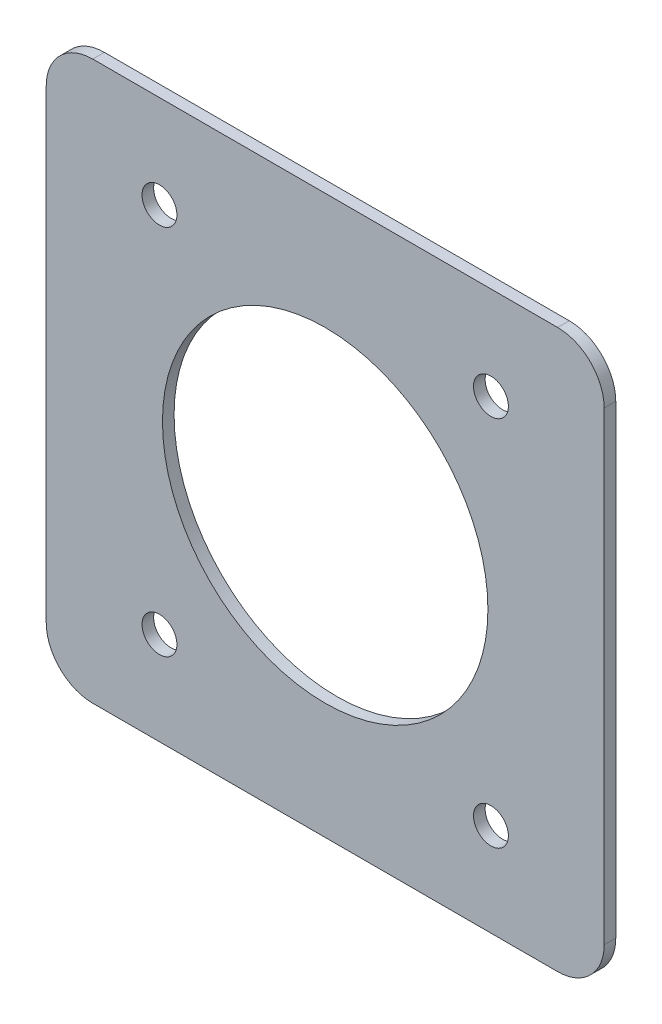
ISO-10303-21;
HEADER;
FILE_DESCRIPTION(('STEP AP214'),'2;1');
FILE_NAME('part.step','',(''),(''),'','','');
FILE_SCHEMA(('AUTOMOTIVE_DESIGN { 1 0 10303 214 1 1 1 1 }'));
ENDSEC;
DATA;
#1=APPLICATION_CONTEXT('core data for automotive mechanical design processes');
#2=APPLICATION_PROTOCOL_DEFINITION('international standard','automotive_design',2000,#1);
#3=PRODUCT_CONTEXT('',#1,'mechanical');
#4=PRODUCT('Part','Part','',(#3));
#5=PRODUCT_RELATED_PRODUCT_CATEGORY('part','',(#4));
#6=PRODUCT_DEFINITION_FORMATION('','',#4);
#7=PRODUCT_DEFINITION_CONTEXT('part definition',#1,'design');
#8=PRODUCT_DEFINITION('design','',#6,#7);
#9=PRODUCT_DEFINITION_SHAPE('','',#8);
#10=(LENGTH_UNIT() NAMED_UNIT(*) SI_UNIT(.MILLI.,.METRE.));
#11=(NAMED_UNIT(*) PLANE_ANGLE_UNIT() SI_UNIT($,.RADIAN.));
#12=(NAMED_UNIT(*) SI_UNIT($,.STERADIAN.) SOLID_ANGLE_UNIT());
#13=UNCERTAINTY_MEASURE_WITH_UNIT(LENGTH_MEASURE(1.E-05),#10,'distance_accuracy_value','');
#14=(GEOMETRIC_REPRESENTATION_CONTEXT(3) GLOBAL_UNCERTAINTY_ASSIGNED_CONTEXT((#13)) GLOBAL_UNIT_ASSIGNED_CONTEXT((#10,
#11,#12)) REPRESENTATION_CONTEXT('',''));
#15=CARTESIAN_POINT('',(0.,0.,0.));
#16=DIRECTION('',(0.,0.,1.));
#17=DIRECTION('',(1.,0.,0.));
#18=AXIS2_PLACEMENT_3D('',#15,#16,#17);
#19=CARTESIAN_POINT('',(-103.997719315894,137.785716341258,3.175));
#20=DIRECTION('',(0.,0.,-1.));
#21=DIRECTION('',(-1.,0.,0.));
#22=AXIS2_PLACEMENT_3D('',#19,#20,#21);
#23=CYLINDRICAL_SURFACE('',#22,12.7);
#24=CARTESIAN_POINT('',(-103.997719315894,137.785716341258,0.));
#25=DIRECTION('',(0.,0.,1.));
#26=DIRECTION('',(1.,0.,0.));
#27=AXIS2_PLACEMENT_3D('',#24,#25,#26);
#28=CIRCLE('',#27,12.7);
#29=CARTESIAN_POINT('',(-103.997719315894,150.485716341258,0.));
#30=VERTEX_POINT('',#29);
#31=CARTESIAN_POINT('',(-91.2977193158941,137.785716341258,0.));
#32=VERTEX_POINT('',#31);
#33=EDGE_CURVE('E145',#30,#32,#28,.F.);
#34=ORIENTED_EDGE('',*,*,#33,.F.);
#35=DIRECTION('',(0.,0.,-1.));
#36=VECTOR('',#35,1.);
#37=CARTESIAN_POINT('',(-103.997719315894,150.485716341258,3.175));
#38=LINE('',#37,#36);
#39=CARTESIAN_POINT('',(-103.997719315894,150.485716341258,3.175));
#40=VERTEX_POINT('',#39);
#41=EDGE_CURVE('E11',#40,#30,#38,.T.);
#42=ORIENTED_EDGE('',*,*,#41,.F.);
#43=CARTESIAN_POINT('',(-103.997719315894,137.785716341258,3.175));
#44=DIRECTION('',(0.,0.,1.));
#45=DIRECTION('',(1.,0.,0.));
#46=AXIS2_PLACEMENT_3D('',#43,#44,#45);
#47=CIRCLE('',#46,12.7);
#48=CARTESIAN_POINT('',(-91.2977193158941,137.785716341258,3.175));
#49=VERTEX_POINT('',#48);
#50=EDGE_CURVE('E175',#40,#49,#47,.F.);
#51=ORIENTED_EDGE('',*,*,#50,.T.);
#52=DIRECTION('',(0.,0.,-1.));
#53=VECTOR('',#52,1.);
#54=CARTESIAN_POINT('',(-91.2977193158941,137.785716341258,3.175));
#55=LINE('',#54,#53);
#56=EDGE_CURVE('E55',#49,#32,#55,.T.);
#57=ORIENTED_EDGE('',*,*,#56,.T.);
#58=EDGE_LOOP('',(#34,#42,#51,#57));
#59=FACE_BOUND('',#58,.T.);
#60=ADVANCED_FACE('F39',(#59),#23,.T.);
#61=CARTESIAN_POINT('',(0.,150.485716341258,3.175));
#62=DIRECTION('',(0.,1.,0.));
#63=DIRECTION('',(0.,0.,1.));
#64=AXIS2_PLACEMENT_3D('',#61,#62,#63);
#65=PLANE('',#64);
#66=DIRECTION('',(1.,0.,0.));
#67=VECTOR('',#66,1.);
#68=CARTESIAN_POINT('',(0.,150.485716341258,0.));
#69=LINE('',#68,#67);
#70=CARTESIAN_POINT('',(-230.997719315894,150.485716341258,0.));
#71=VERTEX_POINT('',#70);
#72=EDGE_CURVE('E147',#71,#30,#69,.T.);
#73=ORIENTED_EDGE('',*,*,#72,.F.);
#74=DIRECTION('',(0.,0.,-1.));
#75=VECTOR('',#74,1.);
#76=CARTESIAN_POINT('',(-230.997719315894,150.485716341258,3.175));
#77=LINE('',#76,#75);
#78=CARTESIAN_POINT('',(-230.997719315894,150.485716341258,3.175));
#79=VERTEX_POINT('',#78);
#80=EDGE_CURVE('E47',#79,#71,#77,.T.);
#81=ORIENTED_EDGE('',*,*,#80,.F.);
#82=DIRECTION('',(1.,0.,0.));
#83=VECTOR('',#82,1.);
#84=CARTESIAN_POINT('',(0.,150.485716341258,3.175));
#85=LINE('',#84,#83);
#86=EDGE_CURVE('E200',#79,#40,#85,.T.);
#87=ORIENTED_EDGE('',*,*,#86,.T.);
#88=ORIENTED_EDGE('',*,*,#41,.T.);
#89=EDGE_LOOP('',(#73,#81,#87,#88));
#90=FACE_BOUND('',#89,.T.);
#91=ADVANCED_FACE('F199',(#90),#65,.T.);
#92=CARTESIAN_POINT('',(-230.997719315894,137.785716341258,3.175));
#93=DIRECTION('',(0.,0.,-1.));
#94=DIRECTION('',(-1.,0.,0.));
#95=AXIS2_PLACEMENT_3D('',#92,#93,#94);
#96=CYLINDRICAL_SURFACE('',#95,12.7);
#97=CARTESIAN_POINT('',(-230.997719315894,137.785716341258,0.));
#98=DIRECTION('',(0.,0.,1.));
#99=DIRECTION('',(1.,0.,0.));
#100=AXIS2_PLACEMENT_3D('',#97,#98,#99);
#101=CIRCLE('',#100,12.7);
#102=CARTESIAN_POINT('',(-243.697719315894,137.785716341258,0.));
#103=VERTEX_POINT('',#102);
#104=EDGE_CURVE('E151',#71,#103,#101,.T.);
#105=ORIENTED_EDGE('',*,*,#104,.T.);
#106=DIRECTION('',(0.,0.,-1.));
#107=VECTOR('',#106,1.);
#108=CARTESIAN_POINT('',(-243.697719315894,137.785716341258,3.175));
#109=LINE('',#108,#107);
#110=CARTESIAN_POINT('',(-243.697719315894,137.785716341258,3.175));
#111=VERTEX_POINT('',#110);
#112=EDGE_CURVE('E182',#111,#103,#109,.T.);
#113=ORIENTED_EDGE('',*,*,#112,.F.);
#114=CARTESIAN_POINT('',(-230.997719315894,137.785716341258,3.175));
#115=DIRECTION('',(0.,0.,1.));
#116=DIRECTION('',(1.,0.,0.));
#117=AXIS2_PLACEMENT_3D('',#114,#115,#116);
#118=CIRCLE('',#117,12.7);
#119=EDGE_CURVE('E189',#79,#111,#118,.T.);
#120=ORIENTED_EDGE('',*,*,#119,.F.);
#121=ORIENTED_EDGE('',*,*,#80,.T.);
#122=EDGE_LOOP('',(#105,#113,#120,#121));
#123=FACE_BOUND('',#122,.T.);
#124=ADVANCED_FACE('F187',(#123),#96,.T.);
#125=CARTESIAN_POINT('',(-243.697719315894,0.,3.175));
#126=DIRECTION('',(1.,0.,0.));
#127=DIRECTION('',(0.,1.,0.));
#128=AXIS2_PLACEMENT_3D('',#125,#126,#127);
#129=PLANE('',#128);
#130=DIRECTION('',(0.,-1.,0.));
#131=VECTOR('',#130,1.);
#132=CARTESIAN_POINT('',(-243.697719315894,0.,0.));
#133=LINE('',#132,#131);
#134=CARTESIAN_POINT('',(-243.697719315894,10.7857163412583,0.));
#135=VERTEX_POINT('',#134);
#136=EDGE_CURVE('E153',#103,#135,#133,.T.);
#137=ORIENTED_EDGE('',*,*,#136,.T.);
#138=DIRECTION('',(0.,0.,-1.));
#139=VECTOR('',#138,1.);
#140=CARTESIAN_POINT('',(-243.697719315894,10.7857163412583,3.175));
#141=LINE('',#140,#139);
#142=CARTESIAN_POINT('',(-243.697719315894,10.7857163412583,3.175));
#143=VERTEX_POINT('',#142);
#144=EDGE_CURVE('E179',#143,#135,#141,.T.);
#145=ORIENTED_EDGE('',*,*,#144,.F.);
#146=DIRECTION('',(0.,-1.,0.));
#147=VECTOR('',#146,1.);
#148=CARTESIAN_POINT('',(-243.697719315894,0.,3.175));
#149=LINE('',#148,#147);
#150=EDGE_CURVE('E271',#111,#143,#149,.T.);
#151=ORIENTED_EDGE('',*,*,#150,.F.);
#152=ORIENTED_EDGE('',*,*,#112,.T.);
#153=EDGE_LOOP('',(#137,#145,#151,#152));
#154=FACE_BOUND('',#153,.T.);
#155=ADVANCED_FACE('F223',(#154),#129,.F.);
#156=CARTESIAN_POINT('',(-230.997719315894,10.7857163412582,3.175));
#157=DIRECTION('',(0.,0.,-1.));
#158=DIRECTION('',(-1.,0.,0.));
#159=AXIS2_PLACEMENT_3D('',#156,#157,#158);
#160=CYLINDRICAL_SURFACE('',#159,12.7);
#161=CARTESIAN_POINT('',(-230.997719315894,10.7857163412582,0.));
#162=DIRECTION('',(0.,0.,1.));
#163=DIRECTION('',(1.,0.,0.));
#164=AXIS2_PLACEMENT_3D('',#161,#162,#163);
#165=CIRCLE('',#164,12.7);
#166=CARTESIAN_POINT('',(-230.997719315894,-1.91428365874183,0.));
#167=VERTEX_POINT('',#166);
#168=EDGE_CURVE('E155',#135,#167,#165,.T.);
#169=ORIENTED_EDGE('',*,*,#168,.T.);
#170=DIRECTION('',(0.,0.,-1.));
#171=VECTOR('',#170,1.);
#172=CARTESIAN_POINT('',(-230.997719315894,-1.91428365874183,3.175));
#173=LINE('',#172,#171);
#174=CARTESIAN_POINT('',(-230.997719315894,-1.91428365874183,3.175));
#175=VERTEX_POINT('',#174);
#176=EDGE_CURVE('E125',#175,#167,#173,.T.);
#177=ORIENTED_EDGE('',*,*,#176,.F.);
#178=CARTESIAN_POINT('',(-230.997719315894,10.7857163412582,3.175));
#179=DIRECTION('',(0.,0.,1.));
#180=DIRECTION('',(1.,0.,0.));
#181=AXIS2_PLACEMENT_3D('',#178,#179,#180);
#182=CIRCLE('',#181,12.7);
#183=EDGE_CURVE('E113',#143,#175,#182,.T.);
#184=ORIENTED_EDGE('',*,*,#183,.F.);
#185=ORIENTED_EDGE('',*,*,#144,.T.);
#186=EDGE_LOOP('',(#169,#177,#184,#185));
#187=FACE_BOUND('',#186,.T.);
#188=ADVANCED_FACE('F228',(#187),#160,.T.);
#189=CARTESIAN_POINT('',(0.,-1.9142836587418,3.175));
#190=DIRECTION('',(0.,1.,0.));
#191=DIRECTION('',(-1.,0.,0.));
#192=AXIS2_PLACEMENT_3D('',#189,#190,#191);
#193=PLANE('',#192);
#194=DIRECTION('',(1.,0.,0.));
#195=VECTOR('',#194,1.);
#196=CARTESIAN_POINT('',(0.,-1.9142836587418,0.));
#197=LINE('',#196,#195);
#198=CARTESIAN_POINT('',(-103.997719315894,-1.91428365874181,0.));
#199=VERTEX_POINT('',#198);
#200=EDGE_CURVE('E122',#167,#199,#197,.T.);
#201=ORIENTED_EDGE('',*,*,#200,.T.);
#202=DIRECTION('',(0.,0.,-1.));
#203=VECTOR('',#202,1.);
#204=CARTESIAN_POINT('',(-103.997719315894,-1.91428365874181,3.175));
#205=LINE('',#204,#203);
#206=CARTESIAN_POINT('',(-103.997719315894,-1.91428365874181,3.175));
#207=VERTEX_POINT('',#206);
#208=EDGE_CURVE('E119',#207,#199,#205,.T.);
#209=ORIENTED_EDGE('',*,*,#208,.F.);
#210=DIRECTION('',(1.,0.,0.));
#211=VECTOR('',#210,1.);
#212=CARTESIAN_POINT('',(0.,-1.9142836587418,3.175));
#213=LINE('',#212,#211);
#214=EDGE_CURVE('E105',#175,#207,#213,.T.);
#215=ORIENTED_EDGE('',*,*,#214,.F.);
#216=ORIENTED_EDGE('',*,*,#176,.T.);
#217=EDGE_LOOP('',(#201,#209,#215,#216));
#218=FACE_BOUND('',#217,.T.);
#219=ADVANCED_FACE('F120',(#218),#193,.F.);
#220=CARTESIAN_POINT('',(-103.997719315894,10.7857163412582,3.175));
#221=DIRECTION('',(0.,0.,-1.));
#222=DIRECTION('',(-1.,0.,0.));
#223=AXIS2_PLACEMENT_3D('',#220,#221,#222);
#224=CYLINDRICAL_SURFACE('',#223,12.7);
#225=CARTESIAN_POINT('',(-103.997719315894,10.7857163412582,0.));
#226=DIRECTION('',(0.,0.,1.));
#227=DIRECTION('',(1.,0.,0.));
#228=AXIS2_PLACEMENT_3D('',#225,#226,#227);
#229=CIRCLE('',#228,12.7);
#230=CARTESIAN_POINT('',(-91.297719315894,10.7857163412583,0.));
#231=VERTEX_POINT('',#230);
#232=EDGE_CURVE('E158',#199,#231,#229,.T.);
#233=ORIENTED_EDGE('',*,*,#232,.T.);
#234=DIRECTION('',(0.,0.,-1.));
#235=VECTOR('',#234,1.);
#236=CARTESIAN_POINT('',(-91.297719315894,10.7857163412583,3.175));
#237=LINE('',#236,#235);
#238=CARTESIAN_POINT('',(-91.297719315894,10.7857163412583,3.175));
#239=VERTEX_POINT('',#238);
#240=EDGE_CURVE('E81',#239,#231,#237,.T.);
#241=ORIENTED_EDGE('',*,*,#240,.F.);
#242=CARTESIAN_POINT('',(-103.997719315894,10.7857163412582,3.175));
#243=DIRECTION('',(0.,0.,1.));
#244=DIRECTION('',(1.,0.,0.));
#245=AXIS2_PLACEMENT_3D('',#242,#243,#244);
#246=CIRCLE('',#245,12.7);
#247=EDGE_CURVE('E111',#207,#239,#246,.T.);
#248=ORIENTED_EDGE('',*,*,#247,.F.);
#249=ORIENTED_EDGE('',*,*,#208,.T.);
#250=EDGE_LOOP('',(#233,#241,#248,#249));
#251=FACE_BOUND('',#250,.T.);
#252=ADVANCED_FACE('F127',(#251),#224,.T.);
#253=CARTESIAN_POINT('',(-212.773219315894,125.085716341257,3.175));
#254=DIRECTION('',(0.,0.,-1.));
#255=DIRECTION('',(-1.,0.,0.));
#256=AXIS2_PLACEMENT_3D('',#253,#254,#255);
#257=CYLINDRICAL_SURFACE('',#256,4.76249999999992);
#258=CARTESIAN_POINT('',(-212.773219315894,125.085716341257,3.175));
#259=DIRECTION('',(0.,0.,1.));
#260=DIRECTION('',(1.,0.,0.));
#261=AXIS2_PLACEMENT_3D('',#258,#259,#260);
#262=CIRCLE('',#261,4.76249999999992);
#263=CARTESIAN_POINT('',(-208.010719315894,125.085716341257,3.175));
#264=VERTEX_POINT('',#263);
#265=EDGE_CURVE('E139',#264,#264,#262,.T.);
#266=ORIENTED_EDGE('',*,*,#265,.T.);
#267=EDGE_LOOP('',(#266));
#268=FACE_BOUND('',#267,.T.);
#269=CARTESIAN_POINT('',(-212.773219315894,125.085716341257,0.));
#270=DIRECTION('',(0.,0.,1.));
#271=DIRECTION('',(1.,0.,0.));
#272=AXIS2_PLACEMENT_3D('',#269,#270,#271);
#273=CIRCLE('',#272,4.76249999999992);
#274=CARTESIAN_POINT('',(-208.010719315894,125.085716341257,0.));
#275=VERTEX_POINT('',#274);
#276=EDGE_CURVE('E169',#275,#275,#273,.T.);
#277=ORIENTED_EDGE('',*,*,#276,.F.);
#278=EDGE_LOOP('',(#277));
#279=FACE_BOUND('',#278,.T.);
#280=ADVANCED_FACE('F235',(#268,#279),#257,.F.);
#281=CARTESIAN_POINT('',(-212.773219315894,23.4857163412565,3.175));
#282=DIRECTION('',(0.,0.,-1.));
#283=DIRECTION('',(-1.,0.,0.));
#284=AXIS2_PLACEMENT_3D('',#281,#282,#283);
#285=CYLINDRICAL_SURFACE('',#284,4.76249999999992);
#286=CARTESIAN_POINT('',(-212.773219315894,23.4857163412565,3.175));
#287=DIRECTION('',(0.,0.,1.));
#288=DIRECTION('',(1.,0.,0.));
#289=AXIS2_PLACEMENT_3D('',#286,#287,#288);
#290=CIRCLE('',#289,4.76249999999992);
#291=CARTESIAN_POINT('',(-208.010719315894,23.4857163412565,3.175));
#292=VERTEX_POINT('',#291);
#293=EDGE_CURVE('E136',#292,#292,#290,.T.);
#294=ORIENTED_EDGE('',*,*,#293,.T.);
#295=EDGE_LOOP('',(#294));
#296=FACE_BOUND('',#295,.T.);
#297=CARTESIAN_POINT('',(-212.773219315894,23.4857163412565,0.));
#298=DIRECTION('',(0.,0.,1.));
#299=DIRECTION('',(1.,0.,0.));
#300=AXIS2_PLACEMENT_3D('',#297,#298,#299);
#301=CIRCLE('',#300,4.76249999999992);
#302=CARTESIAN_POINT('',(-208.010719315894,23.4857163412565,0.));
#303=VERTEX_POINT('',#302);
#304=EDGE_CURVE('E166',#303,#303,#301,.T.);
#305=ORIENTED_EDGE('',*,*,#304,.F.);
#306=EDGE_LOOP('',(#305));
#307=FACE_BOUND('',#306,.T.);
#308=ADVANCED_FACE('F212',(#296,#307),#285,.F.);
#309=CARTESIAN_POINT('',(-122.222219315894,23.4857163412565,3.175));
#310=DIRECTION('',(0.,0.,-1.));
#311=DIRECTION('',(-1.,0.,0.));
#312=AXIS2_PLACEMENT_3D('',#309,#310,#311);
#313=CYLINDRICAL_SURFACE('',#312,4.76249999999992);
#314=CARTESIAN_POINT('',(-122.222219315894,23.4857163412565,3.175));
#315=DIRECTION('',(0.,0.,1.));
#316=DIRECTION('',(1.,0.,0.));
#317=AXIS2_PLACEMENT_3D('',#314,#315,#316);
#318=CIRCLE('',#317,4.76249999999992);
#319=CARTESIAN_POINT('',(-117.459719315894,23.4857163412565,3.175));
#320=VERTEX_POINT('',#319);
#321=EDGE_CURVE('E130',#320,#320,#318,.T.);
#322=ORIENTED_EDGE('',*,*,#321,.T.);
#323=EDGE_LOOP('',(#322));
#324=FACE_BOUND('',#323,.T.);
#325=CARTESIAN_POINT('',(-122.222219315894,23.4857163412565,0.));
#326=DIRECTION('',(0.,0.,1.));
#327=DIRECTION('',(1.,0.,0.));
#328=AXIS2_PLACEMENT_3D('',#325,#326,#327);
#329=CIRCLE('',#328,4.76249999999992);
#330=CARTESIAN_POINT('',(-117.459719315894,23.4857163412565,0.));
#331=VERTEX_POINT('',#330);
#332=EDGE_CURVE('E163',#331,#331,#329,.T.);
#333=ORIENTED_EDGE('',*,*,#332,.F.);
#334=EDGE_LOOP('',(#333));
#335=FACE_BOUND('',#334,.T.);
#336=ADVANCED_FACE('F204',(#324,#335),#313,.F.);
#337=CARTESIAN_POINT('',(-91.297719315894,0.,3.175));
#338=DIRECTION('',(1.,0.,0.));
#339=DIRECTION('',(0.,1.,0.));
#340=AXIS2_PLACEMENT_3D('',#337,#338,#339);
#341=PLANE('',#340);
#342=DIRECTION('',(0.,-1.,0.));
#343=VECTOR('',#342,1.);
#344=CARTESIAN_POINT('',(-91.297719315894,0.,0.));
#345=LINE('',#344,#343);
#346=EDGE_CURVE('E160',#32,#231,#345,.T.);
#347=ORIENTED_EDGE('',*,*,#346,.F.);
#348=ORIENTED_EDGE('',*,*,#56,.F.);
#349=DIRECTION('',(0.,-1.,0.));
#350=VECTOR('',#349,1.);
#351=CARTESIAN_POINT('',(-91.297719315894,0.,3.175));
#352=LINE('',#351,#350);
#353=EDGE_CURVE('E128',#49,#239,#352,.T.);
#354=ORIENTED_EDGE('',*,*,#353,.T.);
#355=ORIENTED_EDGE('',*,*,#240,.T.);
#356=EDGE_LOOP('',(#347,#348,#354,#355));
#357=FACE_BOUND('',#356,.T.);
#358=ADVANCED_FACE('F201',(#357),#341,.T.);
#359=CARTESIAN_POINT('',(-122.222219315894,125.085716341257,3.175));
#360=DIRECTION('',(0.,0.,-1.));
#361=DIRECTION('',(-1.,0.,0.));
#362=AXIS2_PLACEMENT_3D('',#359,#360,#361);
#363=CYLINDRICAL_SURFACE('',#362,4.76249999999992);
#364=CARTESIAN_POINT('',(-122.222219315894,125.085716341257,3.175));
#365=DIRECTION('',(0.,0.,1.));
#366=DIRECTION('',(1.,0.,0.));
#367=AXIS2_PLACEMENT_3D('',#364,#365,#366);
#368=CIRCLE('',#367,4.76249999999992);
#369=CARTESIAN_POINT('',(-117.459719315894,125.085716341257,3.175));
#370=VERTEX_POINT('',#369);
#371=EDGE_CURVE('E142',#370,#370,#368,.T.);
#372=ORIENTED_EDGE('',*,*,#371,.T.);
#373=EDGE_LOOP('',(#372));
#374=FACE_BOUND('',#373,.T.);
#375=CARTESIAN_POINT('',(-122.222219315894,125.085716341257,0.));
#376=DIRECTION('',(0.,0.,1.));
#377=DIRECTION('',(1.,0.,0.));
#378=AXIS2_PLACEMENT_3D('',#375,#376,#377);
#379=CIRCLE('',#378,4.76249999999992);
#380=CARTESIAN_POINT('',(-117.459719315894,125.085716341257,0.));
#381=VERTEX_POINT('',#380);
#382=EDGE_CURVE('E172',#381,#381,#379,.T.);
#383=ORIENTED_EDGE('',*,*,#382,.F.);
#384=EDGE_LOOP('',(#383));
#385=FACE_BOUND('',#384,.T.);
#386=ADVANCED_FACE('F203',(#374,#385),#363,.F.);
#387=CARTESIAN_POINT('',(0.,0.,3.175));
#388=DIRECTION('',(0.,0.,1.));
#389=DIRECTION('',(1.,0.,0.));
#390=AXIS2_PLACEMENT_3D('',#387,#388,#389);
#391=PLANE('',#390);
#392=CARTESIAN_POINT('',(-167.497719315894,74.2857163412582,3.175));
#393=DIRECTION('',(0.,0.,1.));
#394=DIRECTION('',(1.,0.,0.));
#395=AXIS2_PLACEMENT_3D('',#392,#393,#394);
#396=CIRCLE('',#395,44.45);
#397=CARTESIAN_POINT('',(-123.047719315894,74.2857163412582,3.175));
#398=VERTEX_POINT('',#397);
#399=EDGE_CURVE('E264',#398,#398,#396,.T.);
#400=ORIENTED_EDGE('',*,*,#399,.F.);
#401=EDGE_LOOP('',(#400));
#402=FACE_BOUND('',#401,.T.);
#403=ORIENTED_EDGE('',*,*,#50,.F.);
#404=ORIENTED_EDGE('',*,*,#86,.F.);
#405=ORIENTED_EDGE('',*,*,#119,.T.);
#406=ORIENTED_EDGE('',*,*,#150,.T.);
#407=ORIENTED_EDGE('',*,*,#183,.T.);
#408=ORIENTED_EDGE('',*,*,#214,.T.);
#409=ORIENTED_EDGE('',*,*,#247,.T.);
#410=ORIENTED_EDGE('',*,*,#353,.F.);
#411=EDGE_LOOP('',(#403,#404,#405,#406,#407,#408,#409,#410));
#412=FACE_BOUND('',#411,.T.);
#413=ORIENTED_EDGE('',*,*,#321,.F.);
#414=EDGE_LOOP('',(#413));
#415=FACE_BOUND('',#414,.T.);
#416=ORIENTED_EDGE('',*,*,#293,.F.);
#417=EDGE_LOOP('',(#416));
#418=FACE_BOUND('',#417,.T.);
#419=ORIENTED_EDGE('',*,*,#265,.F.);
#420=EDGE_LOOP('',(#419));
#421=FACE_BOUND('',#420,.T.);
#422=ORIENTED_EDGE('',*,*,#371,.F.);
#423=EDGE_LOOP('',(#422));
#424=FACE_BOUND('',#423,.T.);
#425=ADVANCED_FACE('F107',(#402,#412,#415,#418,#421,#424),#391,.T.);
#426=CARTESIAN_POINT('',(0.,0.,0.));
#427=DIRECTION('',(0.,0.,1.));
#428=DIRECTION('',(1.,0.,0.));
#429=AXIS2_PLACEMENT_3D('',#426,#427,#428);
#430=PLANE('',#429);
#431=CARTESIAN_POINT('',(-167.497719315894,74.2857163412582,0.));
#432=DIRECTION('',(0.,0.,1.));
#433=DIRECTION('',(1.,0.,0.));
#434=AXIS2_PLACEMENT_3D('',#431,#432,#433);
#435=CIRCLE('',#434,44.45);
#436=CARTESIAN_POINT('',(-123.047719315894,74.2857163412582,0.));
#437=VERTEX_POINT('',#436);
#438=EDGE_CURVE('E148',#437,#437,#435,.T.);
#439=ORIENTED_EDGE('',*,*,#438,.T.);
#440=EDGE_LOOP('',(#439));
#441=FACE_BOUND('',#440,.T.);
#442=ORIENTED_EDGE('',*,*,#33,.T.);
#443=ORIENTED_EDGE('',*,*,#346,.T.);
#444=ORIENTED_EDGE('',*,*,#232,.F.);
#445=ORIENTED_EDGE('',*,*,#200,.F.);
#446=ORIENTED_EDGE('',*,*,#168,.F.);
#447=ORIENTED_EDGE('',*,*,#136,.F.);
#448=ORIENTED_EDGE('',*,*,#104,.F.);
#449=ORIENTED_EDGE('',*,*,#72,.T.);
#450=EDGE_LOOP('',(#442,#443,#444,#445,#446,#447,#448,#449));
#451=FACE_BOUND('',#450,.T.);
#452=ORIENTED_EDGE('',*,*,#332,.T.);
#453=EDGE_LOOP('',(#452));
#454=FACE_BOUND('',#453,.T.);
#455=ORIENTED_EDGE('',*,*,#304,.T.);
#456=EDGE_LOOP('',(#455));
#457=FACE_BOUND('',#456,.T.);
#458=ORIENTED_EDGE('',*,*,#276,.T.);
#459=EDGE_LOOP('',(#458));
#460=FACE_BOUND('',#459,.T.);
#461=ORIENTED_EDGE('',*,*,#382,.T.);
#462=EDGE_LOOP('',(#461));
#463=FACE_BOUND('',#462,.T.);
#464=ADVANCED_FACE('F196',(#441,#451,#454,#457,#460,#463),#430,.F.);
#465=CARTESIAN_POINT('',(-167.497719315894,74.2857163412582,0.));
#466=DIRECTION('',(0.,0.,1.));
#467=DIRECTION('',(1.,0.,0.));
#468=AXIS2_PLACEMENT_3D('',#465,#466,#467);
#469=CYLINDRICAL_SURFACE('',#468,44.45);
#470=ORIENTED_EDGE('',*,*,#438,.F.);
#471=EDGE_LOOP('',(#470));
#472=FACE_BOUND('',#471,.T.);
#473=ORIENTED_EDGE('',*,*,#399,.T.);
#474=EDGE_LOOP('',(#473));
#475=FACE_BOUND('',#474,.T.);
#476=ADVANCED_FACE('F250',(#472,#475),#469,.F.);
#477=CLOSED_SHELL('',(#60,#91,#124,#155,#188,#219,#252,#280,#308,#336,#358,#386,#425,#464,#476));
#478=MANIFOLD_SOLID_BREP('B2',#477);
#479=ADVANCED_BREP_SHAPE_REPRESENTATION('',(#18,#478),#14);
#480=SHAPE_DEFINITION_REPRESENTATION(#9,#479);
ENDSEC;
END-ISO-10303-21;
